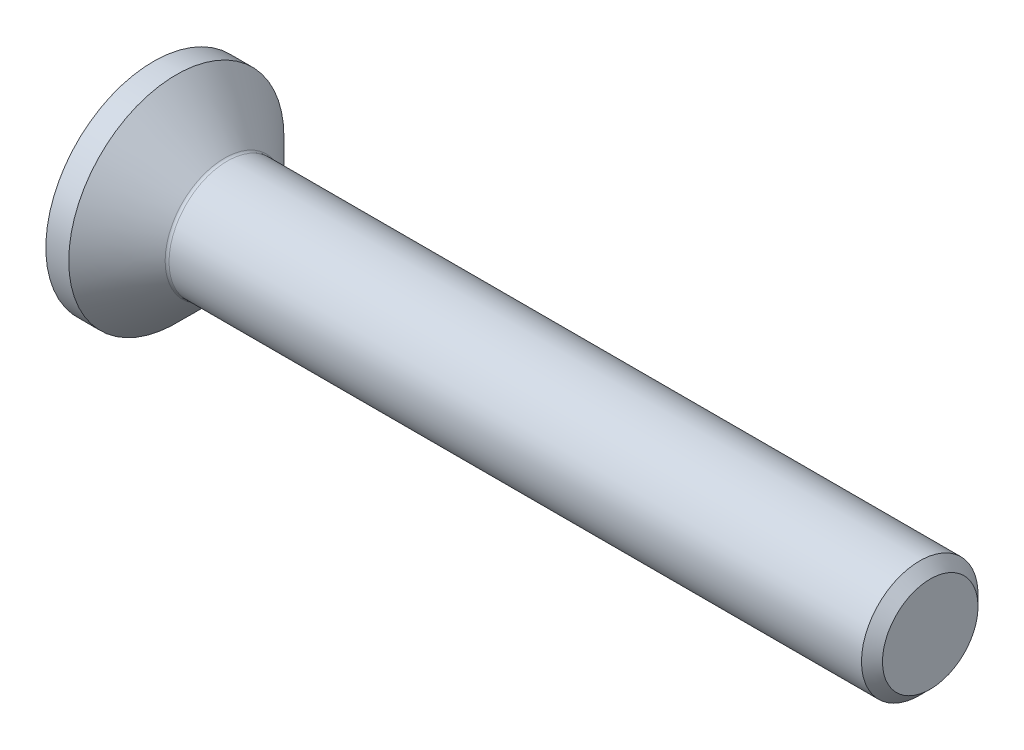
ISO-10303-21;
HEADER;
FILE_DESCRIPTION(('STEP AP214'),'2;1');
FILE_NAME('part.step','',(''),(''),'','','');
FILE_SCHEMA(('AUTOMOTIVE_DESIGN { 1 0 10303 214 1 1 1 1 }'));
ENDSEC;
DATA;
#1=APPLICATION_CONTEXT('core data for automotive mechanical design processes');
#2=APPLICATION_PROTOCOL_DEFINITION('international standard','automotive_design',2000,#1);
#3=PRODUCT_CONTEXT('',#1,'mechanical');
#4=PRODUCT('Part','Part','',(#3));
#5=PRODUCT_RELATED_PRODUCT_CATEGORY('part','',(#4));
#6=PRODUCT_DEFINITION_FORMATION('','',#4);
#7=PRODUCT_DEFINITION_CONTEXT('part definition',#1,'design');
#8=PRODUCT_DEFINITION('design','',#6,#7);
#9=PRODUCT_DEFINITION_SHAPE('','',#8);
#10=(LENGTH_UNIT() NAMED_UNIT(*) SI_UNIT(.MILLI.,.METRE.));
#11=(NAMED_UNIT(*) PLANE_ANGLE_UNIT() SI_UNIT($,.RADIAN.));
#12=(NAMED_UNIT(*) SI_UNIT($,.STERADIAN.) SOLID_ANGLE_UNIT());
#13=UNCERTAINTY_MEASURE_WITH_UNIT(LENGTH_MEASURE(1.E-05),#10,'distance_accuracy_value','');
#14=(GEOMETRIC_REPRESENTATION_CONTEXT(3) GLOBAL_UNCERTAINTY_ASSIGNED_CONTEXT((#13)) GLOBAL_UNIT_ASSIGNED_CONTEXT((#10,
#11,#12)) REPRESENTATION_CONTEXT('',''));
#15=CARTESIAN_POINT('',(0.,0.,0.));
#16=DIRECTION('',(0.,0.,1.));
#17=DIRECTION('',(1.,0.,0.));
#18=AXIS2_PLACEMENT_3D('',#15,#16,#17);
#19=CARTESIAN_POINT('',(1.86,0.,0.));
#20=DIRECTION('',(-1.,0.,0.));
#21=DIRECTION('',(0.,0.,1.));
#22=AXIS2_PLACEMENT_3D('',#19,#20,#21);
#23=CONICAL_SURFACE('',#22,1.5,0.785398163397448);
#24=CARTESIAN_POINT('',(0.589999999999997,0.,0.));
#25=DIRECTION('',(-1.,0.,0.));
#26=DIRECTION('',(0.,0.,1.));
#27=AXIS2_PLACEMENT_3D('',#24,#25,#26);
#28=CIRCLE('',#27,2.77);
#29=CARTESIAN_POINT('',(0.589999999999997,0.,2.77));
#30=VERTEX_POINT('',#29);
#31=EDGE_CURVE('E44',#30,#30,#28,.F.);
#32=ORIENTED_EDGE('',*,*,#31,.T.);
#33=EDGE_LOOP('',(#32));
#34=FACE_BOUND('',#33,.T.);
#35=CARTESIAN_POINT('',(1.83071067811865,0.,0.));
#36=DIRECTION('',(-1.,0.,0.));
#37=DIRECTION('',(0.,0.,1.));
#38=AXIS2_PLACEMENT_3D('',#35,#36,#37);
#39=CIRCLE('',#38,1.52928932188134);
#40=CARTESIAN_POINT('',(1.83071067811865,0.,1.52928932188134));
#41=VERTEX_POINT('',#40);
#42=EDGE_CURVE('E163',#41,#41,#39,.T.);
#43=ORIENTED_EDGE('',*,*,#42,.T.);
#44=EDGE_LOOP('',(#43));
#45=FACE_BOUND('',#44,.T.);
#46=ADVANCED_FACE('F40',(#34,#45),#23,.T.);
#47=CARTESIAN_POINT('',(-0.587069180985524,0.,0.));
#48=DIRECTION('',(-1.,0.,0.));
#49=DIRECTION('',(0.,0.,1.));
#50=AXIS2_PLACEMENT_3D('',#47,#48,#49);
#51=CYLINDRICAL_SURFACE('',#50,1.5);
#52=CARTESIAN_POINT('',(19.7295,0.,0.));
#53=DIRECTION('',(-1.,0.,0.));
#54=DIRECTION('',(0.,0.,1.));
#55=AXIS2_PLACEMENT_3D('',#52,#53,#54);
#56=CIRCLE('',#55,1.5);
#57=CARTESIAN_POINT('',(19.7295,0.,1.5));
#58=VERTEX_POINT('',#57);
#59=EDGE_CURVE('E49',#58,#58,#56,.T.);
#60=ORIENTED_EDGE('',*,*,#59,.T.);
#61=EDGE_LOOP('',(#60));
#62=FACE_BOUND('',#61,.T.);
#63=CARTESIAN_POINT('',(1.90142135623731,0.,0.));
#64=DIRECTION('',(-1.,0.,0.));
#65=DIRECTION('',(0.,0.,1.));
#66=AXIS2_PLACEMENT_3D('',#63,#64,#65);
#67=CIRCLE('',#66,1.5);
#68=CARTESIAN_POINT('',(1.90142135623731,0.,1.5));
#69=VERTEX_POINT('',#68);
#70=EDGE_CURVE('E160',#69,#69,#67,.F.);
#71=ORIENTED_EDGE('',*,*,#70,.T.);
#72=EDGE_LOOP('',(#71));
#73=FACE_BOUND('',#72,.T.);
#74=ADVANCED_FACE('F131',(#62,#73),#51,.T.);
#75=CARTESIAN_POINT('',(20.,1.5,0.));
#76=DIRECTION('',(-1.,0.,0.));
#77=DIRECTION('',(0.,0.,1.));
#78=AXIS2_PLACEMENT_3D('',#75,#76,#77);
#79=PLANE('',#78);
#80=CARTESIAN_POINT('',(20.,0.,0.));
#81=DIRECTION('',(-1.,0.,0.));
#82=DIRECTION('',(0.,0.,1.));
#83=AXIS2_PLACEMENT_3D('',#80,#81,#82);
#84=CIRCLE('',#83,1.2295);
#85=CARTESIAN_POINT('',(20.,0.,1.2295));
#86=VERTEX_POINT('',#85);
#87=EDGE_CURVE('E11',#86,#86,#84,.F.);
#88=ORIENTED_EDGE('',*,*,#87,.T.);
#89=EDGE_LOOP('',(#88));
#90=FACE_BOUND('',#89,.T.);
#91=ADVANCED_FACE('F137',(#90),#79,.F.);
#92=CARTESIAN_POINT('',(1.90142135623731,0.,0.));
#93=DIRECTION('',(-1.,0.,0.));
#94=DIRECTION('',(0.,0.,1.));
#95=AXIS2_PLACEMENT_3D('',#92,#93,#94);
#96=TOROIDAL_SURFACE('',#95,1.6,0.1);
#97=ORIENTED_EDGE('',*,*,#70,.F.);
#98=EDGE_LOOP('',(#97));
#99=FACE_BOUND('',#98,.T.);
#100=ORIENTED_EDGE('',*,*,#42,.F.);
#101=EDGE_LOOP('',(#100));
#102=FACE_BOUND('',#101,.T.);
#103=ADVANCED_FACE('F148',(#99,#102),#96,.F.);
#104=CARTESIAN_POINT('',(19.7295,0.,0.));
#105=DIRECTION('',(-1.,0.,0.));
#106=DIRECTION('',(0.,0.,1.));
#107=AXIS2_PLACEMENT_3D('',#104,#105,#106);
#108=CONICAL_SURFACE('',#107,1.5,0.78539816339744);
#109=ORIENTED_EDGE('',*,*,#87,.F.);
#110=EDGE_LOOP('',(#109));
#111=FACE_BOUND('',#110,.T.);
#112=ORIENTED_EDGE('',*,*,#59,.F.);
#113=EDGE_LOOP('',(#112));
#114=FACE_BOUND('',#113,.T.);
#115=ADVANCED_FACE('F42',(#111,#114),#108,.T.);
#116=CARTESIAN_POINT('',(11.8531386861314,0.,0.));
#117=DIRECTION('',(1.,0.,0.));
#118=DIRECTION('',(0.,0.,-1.));
#119=AXIS2_PLACEMENT_3D('',#116,#117,#118);
#120=CYLINDRICAL_SURFACE('',#119,2.77);
#121=ORIENTED_EDGE('',*,*,#31,.F.);
#122=EDGE_LOOP('',(#121));
#123=FACE_BOUND('',#122,.T.);
#124=CARTESIAN_POINT('',(0.,0.,0.));
#125=DIRECTION('',(1.,0.,0.));
#126=DIRECTION('',(0.,0.,-1.));
#127=AXIS2_PLACEMENT_3D('',#124,#125,#126);
#128=CIRCLE('',#127,2.77);
#129=CARTESIAN_POINT('',(0.,0.,-2.77));
#130=VERTEX_POINT('',#129);
#131=EDGE_CURVE('E229',#130,#130,#128,.F.);
#132=ORIENTED_EDGE('',*,*,#131,.F.);
#133=EDGE_LOOP('',(#132));
#134=FACE_BOUND('',#133,.T.);
#135=ADVANCED_FACE('F118',(#123,#134),#120,.T.);
#136=CARTESIAN_POINT('',(1.67735026918963,0.,0.));
#137=DIRECTION('',(-1.,0.,0.));
#138=DIRECTION('',(0.,0.,1.));
#139=AXIS2_PLACEMENT_3D('',#136,#137,#138);
#140=CONICAL_SURFACE('',#139,0.,1.0471975511966);
#141=CARTESIAN_POINT('',(1.1,0.,0.));
#142=DIRECTION('',(-1.,0.,0.));
#143=DIRECTION('',(0.,0.,1.));
#144=AXIS2_PLACEMENT_3D('',#141,#142,#143);
#145=CIRCLE('',#144,1.);
#146=CARTESIAN_POINT('',(1.1,0.5,0.866025403784439));
#147=VERTEX_POINT('',#146);
#148=CARTESIAN_POINT('',(1.1,1.,0.));
#149=VERTEX_POINT('',#148);
#150=EDGE_CURVE('E169',#147,#149,#145,.T.);
#151=ORIENTED_EDGE('',*,*,#150,.T.);
#152=CARTESIAN_POINT('',(1.1,0.5,-0.866025403784439));
#153=VERTEX_POINT('',#152);
#154=EDGE_CURVE('E164',#149,#153,#145,.T.);
#155=ORIENTED_EDGE('',*,*,#154,.T.);
#156=CARTESIAN_POINT('',(1.1,-0.5,-0.866025403784439));
#157=VERTEX_POINT('',#156);
#158=EDGE_CURVE('E167',#153,#157,#145,.T.);
#159=ORIENTED_EDGE('',*,*,#158,.T.);
#160=CARTESIAN_POINT('',(1.1,-1.,0.));
#161=VERTEX_POINT('',#160);
#162=EDGE_CURVE('E248',#157,#161,#145,.T.);
#163=ORIENTED_EDGE('',*,*,#162,.T.);
#164=CARTESIAN_POINT('',(1.1,-0.5,0.866025403784438));
#165=VERTEX_POINT('',#164);
#166=EDGE_CURVE('E56',#161,#165,#145,.T.);
#167=ORIENTED_EDGE('',*,*,#166,.T.);
#168=EDGE_CURVE('E178',#165,#147,#145,.T.);
#169=ORIENTED_EDGE('',*,*,#168,.T.);
#170=EDGE_LOOP('',(#151,#155,#159,#163,#167,#169));
#171=FACE_BOUND('',#170,.T.);
#172=CARTESIAN_POINT('',(1.67735026918963,0.,0.));
#173=VERTEX_POINT('',#172);
#174=VERTEX_LOOP('',#173);
#175=FACE_BOUND('',#174,.T.);
#176=ADVANCED_FACE('F115',(#171,#175),#140,.F.);
#177=CARTESIAN_POINT('',(1.1,0.,-1.15470053837925));
#178=DIRECTION('',(1.,0.,0.));
#179=DIRECTION('',(0.,0.,-1.));
#180=AXIS2_PLACEMENT_3D('',#177,#178,#179);
#181=PLANE('',#180);
#182=ORIENTED_EDGE('',*,*,#166,.F.);
#183=DIRECTION('',(0.,0.,-1.));
#184=VECTOR('',#183,1.);
#185=CARTESIAN_POINT('',(1.1,-1.,0.577350269189626));
#186=LINE('',#185,#184);
#187=CARTESIAN_POINT('',(1.1,-1.,0.577350269189626));
#188=VERTEX_POINT('',#187);
#189=EDGE_CURVE('E189',#188,#161,#186,.T.);
#190=ORIENTED_EDGE('',*,*,#189,.F.);
#191=DIRECTION('',(0.,-0.866025403784438,-0.5));
#192=VECTOR('',#191,1.);
#193=CARTESIAN_POINT('',(1.1,0.,1.15470053837925));
#194=LINE('',#193,#192);
#195=EDGE_CURVE('E213',#165,#188,#194,.T.);
#196=ORIENTED_EDGE('',*,*,#195,.F.);
#197=EDGE_LOOP('',(#182,#190,#196));
#198=FACE_BOUND('',#197,.T.);
#199=ADVANCED_FACE('F117',(#198),#181,.F.);
#200=ORIENTED_EDGE('',*,*,#168,.F.);
#201=CARTESIAN_POINT('',(1.1,0.,1.15470053837925));
#202=VERTEX_POINT('',#201);
#203=EDGE_CURVE('E210',#202,#165,#194,.T.);
#204=ORIENTED_EDGE('',*,*,#203,.F.);
#205=DIRECTION('',(0.,-0.866025403784439,0.5));
#206=VECTOR('',#205,1.);
#207=CARTESIAN_POINT('',(1.1,1.,0.577350269189626));
#208=LINE('',#207,#206);
#209=EDGE_CURVE('E217',#147,#202,#208,.T.);
#210=ORIENTED_EDGE('',*,*,#209,.F.);
#211=EDGE_LOOP('',(#200,#204,#210));
#212=FACE_BOUND('',#211,.T.);
#213=ADVANCED_FACE('F124',(#212),#181,.F.);
#214=ORIENTED_EDGE('',*,*,#150,.F.);
#215=CARTESIAN_POINT('',(1.1,1.,0.577350269189626));
#216=VERTEX_POINT('',#215);
#217=EDGE_CURVE('E214',#216,#147,#208,.T.);
#218=ORIENTED_EDGE('',*,*,#217,.F.);
#219=DIRECTION('',(0.,0.,1.));
#220=VECTOR('',#219,1.);
#221=CARTESIAN_POINT('',(1.1,1.,-0.577350269189625));
#222=LINE('',#221,#220);
#223=EDGE_CURVE('E221',#149,#216,#222,.T.);
#224=ORIENTED_EDGE('',*,*,#223,.F.);
#225=EDGE_LOOP('',(#214,#218,#224));
#226=FACE_BOUND('',#225,.T.);
#227=ADVANCED_FACE('F279',(#226),#181,.F.);
#228=ORIENTED_EDGE('',*,*,#154,.F.);
#229=CARTESIAN_POINT('',(1.1,1.,-0.577350269189625));
#230=VERTEX_POINT('',#229);
#231=EDGE_CURVE('E218',#230,#149,#222,.T.);
#232=ORIENTED_EDGE('',*,*,#231,.F.);
#233=DIRECTION('',(0.,0.866025403784438,0.5));
#234=VECTOR('',#233,1.);
#235=CARTESIAN_POINT('',(1.1,0.,-1.15470053837925));
#236=LINE('',#235,#234);
#237=EDGE_CURVE('E225',#153,#230,#236,.T.);
#238=ORIENTED_EDGE('',*,*,#237,.F.);
#239=EDGE_LOOP('',(#228,#232,#238));
#240=FACE_BOUND('',#239,.T.);
#241=ADVANCED_FACE('F284',(#240),#181,.F.);
#242=ORIENTED_EDGE('',*,*,#158,.F.);
#243=CARTESIAN_POINT('',(1.1,0.,-1.15470053837925));
#244=VERTEX_POINT('',#243);
#245=EDGE_CURVE('E222',#244,#153,#236,.T.);
#246=ORIENTED_EDGE('',*,*,#245,.F.);
#247=DIRECTION('',(0.,0.866025403784438,-0.5));
#248=VECTOR('',#247,1.);
#249=CARTESIAN_POINT('',(1.1,-0.999999999999999,-0.577350269189627));
#250=LINE('',#249,#248);
#251=EDGE_CURVE('E193',#157,#244,#250,.T.);
#252=ORIENTED_EDGE('',*,*,#251,.F.);
#253=EDGE_LOOP('',(#242,#246,#252));
#254=FACE_BOUND('',#253,.T.);
#255=ADVANCED_FACE('F253',(#254),#181,.F.);
#256=ORIENTED_EDGE('',*,*,#162,.F.);
#257=CARTESIAN_POINT('',(1.1,-0.999999999999999,-0.577350269189627));
#258=VERTEX_POINT('',#257);
#259=EDGE_CURVE('E226',#258,#157,#250,.T.);
#260=ORIENTED_EDGE('',*,*,#259,.F.);
#261=EDGE_CURVE('E209',#161,#258,#186,.T.);
#262=ORIENTED_EDGE('',*,*,#261,.F.);
#263=EDGE_LOOP('',(#256,#260,#262));
#264=FACE_BOUND('',#263,.T.);
#265=ADVANCED_FACE('F127',(#264),#181,.F.);
#266=CARTESIAN_POINT('',(1.1,-1.,0.577350269189626));
#267=DIRECTION('',(0.,1.,0.));
#268=DIRECTION('',(0.,0.,1.));
#269=AXIS2_PLACEMENT_3D('',#266,#267,#268);
#270=PLANE('',#269);
#271=DIRECTION('',(0.,0.,-1.));
#272=VECTOR('',#271,1.);
#273=CARTESIAN_POINT('',(0.,-1.,0.577350269189626));
#274=LINE('',#273,#272);
#275=CARTESIAN_POINT('',(0.,-1.,0.577350269189626));
#276=VERTEX_POINT('',#275);
#277=CARTESIAN_POINT('',(0.,-0.999999999999999,-0.577350269189627));
#278=VERTEX_POINT('',#277);
#279=EDGE_CURVE('E190',#276,#278,#274,.T.);
#280=ORIENTED_EDGE('',*,*,#279,.F.);
#281=DIRECTION('',(-1.,0.,0.));
#282=VECTOR('',#281,1.);
#283=CARTESIAN_POINT('',(1.1,-1.,0.577350269189626));
#284=LINE('',#283,#282);
#285=EDGE_CURVE('E185',#188,#276,#284,.T.);
#286=ORIENTED_EDGE('',*,*,#285,.F.);
#287=ORIENTED_EDGE('',*,*,#189,.T.);
#288=ORIENTED_EDGE('',*,*,#261,.T.);
#289=DIRECTION('',(-1.,0.,0.));
#290=VECTOR('',#289,1.);
#291=CARTESIAN_POINT('',(1.1,-0.999999999999999,-0.577350269189627));
#292=LINE('',#291,#290);
#293=EDGE_CURVE('E187',#258,#278,#292,.T.);
#294=ORIENTED_EDGE('',*,*,#293,.T.);
#295=EDGE_LOOP('',(#280,#286,#287,#288,#294));
#296=FACE_BOUND('',#295,.T.);
#297=ADVANCED_FACE('F242',(#296),#270,.T.);
#298=CARTESIAN_POINT('',(1.1,0.,1.15470053837925));
#299=DIRECTION('',(0.,0.5,-0.866025403784439));
#300=DIRECTION('',(0.,0.866025403784438,0.5));
#301=AXIS2_PLACEMENT_3D('',#298,#299,#300);
#302=PLANE('',#301);
#303=DIRECTION('',(0.,-0.866025403784438,-0.5));
#304=VECTOR('',#303,1.);
#305=CARTESIAN_POINT('',(0.,0.,1.15470053837925));
#306=LINE('',#305,#304);
#307=CARTESIAN_POINT('',(0.,0.,1.15470053837925));
#308=VERTEX_POINT('',#307);
#309=EDGE_CURVE('E194',#308,#276,#306,.T.);
#310=ORIENTED_EDGE('',*,*,#309,.F.);
#311=DIRECTION('',(-1.,0.,0.));
#312=VECTOR('',#311,1.);
#313=CARTESIAN_POINT('',(1.1,0.,1.15470053837925));
#314=LINE('',#313,#312);
#315=EDGE_CURVE('E183',#202,#308,#314,.T.);
#316=ORIENTED_EDGE('',*,*,#315,.F.);
#317=ORIENTED_EDGE('',*,*,#203,.T.);
#318=ORIENTED_EDGE('',*,*,#195,.T.);
#319=ORIENTED_EDGE('',*,*,#285,.T.);
#320=EDGE_LOOP('',(#310,#316,#317,#318,#319));
#321=FACE_BOUND('',#320,.T.);
#322=ADVANCED_FACE('F272',(#321),#302,.T.);
#323=CARTESIAN_POINT('',(1.1,1.,0.577350269189626));
#324=DIRECTION('',(0.,-0.5,-0.866025403784438));
#325=DIRECTION('',(0.,0.866025403784439,-0.5));
#326=AXIS2_PLACEMENT_3D('',#323,#324,#325);
#327=PLANE('',#326);
#328=DIRECTION('',(0.,-0.866025403784439,0.5));
#329=VECTOR('',#328,1.);
#330=CARTESIAN_POINT('',(0.,1.,0.577350269189626));
#331=LINE('',#330,#329);
#332=CARTESIAN_POINT('',(0.,1.,0.577350269189626));
#333=VERTEX_POINT('',#332);
#334=EDGE_CURVE('E197',#333,#308,#331,.T.);
#335=ORIENTED_EDGE('',*,*,#334,.F.);
#336=DIRECTION('',(-1.,0.,0.));
#337=VECTOR('',#336,1.);
#338=CARTESIAN_POINT('',(1.1,1.,0.577350269189626));
#339=LINE('',#338,#337);
#340=EDGE_CURVE('E181',#216,#333,#339,.T.);
#341=ORIENTED_EDGE('',*,*,#340,.F.);
#342=ORIENTED_EDGE('',*,*,#217,.T.);
#343=ORIENTED_EDGE('',*,*,#209,.T.);
#344=ORIENTED_EDGE('',*,*,#315,.T.);
#345=EDGE_LOOP('',(#335,#341,#342,#343,#344));
#346=FACE_BOUND('',#345,.T.);
#347=ADVANCED_FACE('F266',(#346),#327,.T.);
#348=CARTESIAN_POINT('',(1.1,1.,-0.577350269189625));
#349=DIRECTION('',(0.,-1.,0.));
#350=DIRECTION('',(0.,0.,-1.));
#351=AXIS2_PLACEMENT_3D('',#348,#349,#350);
#352=PLANE('',#351);
#353=DIRECTION('',(0.,0.,1.));
#354=VECTOR('',#353,1.);
#355=CARTESIAN_POINT('',(0.,1.,-0.577350269189625));
#356=LINE('',#355,#354);
#357=CARTESIAN_POINT('',(0.,1.,-0.577350269189625));
#358=VERTEX_POINT('',#357);
#359=EDGE_CURVE('E200',#358,#333,#356,.T.);
#360=ORIENTED_EDGE('',*,*,#359,.F.);
#361=DIRECTION('',(-1.,0.,0.));
#362=VECTOR('',#361,1.);
#363=CARTESIAN_POINT('',(1.1,1.,-0.577350269189625));
#364=LINE('',#363,#362);
#365=EDGE_CURVE('E179',#230,#358,#364,.T.);
#366=ORIENTED_EDGE('',*,*,#365,.F.);
#367=ORIENTED_EDGE('',*,*,#231,.T.);
#368=ORIENTED_EDGE('',*,*,#223,.T.);
#369=ORIENTED_EDGE('',*,*,#340,.T.);
#370=EDGE_LOOP('',(#360,#366,#367,#368,#369));
#371=FACE_BOUND('',#370,.T.);
#372=ADVANCED_FACE('F262',(#371),#352,.T.);
#373=CARTESIAN_POINT('',(1.1,0.,-1.15470053837925));
#374=DIRECTION('',(0.,-0.5,0.866025403784438));
#375=DIRECTION('',(0.,-0.866025403784439,-0.5));
#376=AXIS2_PLACEMENT_3D('',#373,#374,#375);
#377=PLANE('',#376);
#378=DIRECTION('',(0.,0.866025403784438,0.5));
#379=VECTOR('',#378,1.);
#380=CARTESIAN_POINT('',(0.,0.,-1.15470053837925));
#381=LINE('',#380,#379);
#382=CARTESIAN_POINT('',(0.,0.,-1.15470053837925));
#383=VERTEX_POINT('',#382);
#384=EDGE_CURVE('E203',#383,#358,#381,.T.);
#385=ORIENTED_EDGE('',*,*,#384,.F.);
#386=DIRECTION('',(-1.,0.,0.));
#387=VECTOR('',#386,1.);
#388=CARTESIAN_POINT('',(1.1,0.,-1.15470053837925));
#389=LINE('',#388,#387);
#390=EDGE_CURVE('E171',#244,#383,#389,.T.);
#391=ORIENTED_EDGE('',*,*,#390,.F.);
#392=ORIENTED_EDGE('',*,*,#245,.T.);
#393=ORIENTED_EDGE('',*,*,#237,.T.);
#394=ORIENTED_EDGE('',*,*,#365,.T.);
#395=EDGE_LOOP('',(#385,#391,#392,#393,#394));
#396=FACE_BOUND('',#395,.T.);
#397=ADVANCED_FACE('F257',(#396),#377,.T.);
#398=CARTESIAN_POINT('',(1.1,-0.999999999999999,-0.577350269189627));
#399=DIRECTION('',(0.,0.5,0.866025403784439));
#400=DIRECTION('',(0.,-0.866025403784438,0.5));
#401=AXIS2_PLACEMENT_3D('',#398,#399,#400);
#402=PLANE('',#401);
#403=DIRECTION('',(0.,0.866025403784438,-0.5));
#404=VECTOR('',#403,1.);
#405=CARTESIAN_POINT('',(0.,-0.999999999999999,-0.577350269189627));
#406=LINE('',#405,#404);
#407=EDGE_CURVE('E64',#278,#383,#406,.T.);
#408=ORIENTED_EDGE('',*,*,#407,.F.);
#409=ORIENTED_EDGE('',*,*,#293,.F.);
#410=ORIENTED_EDGE('',*,*,#259,.T.);
#411=ORIENTED_EDGE('',*,*,#251,.T.);
#412=ORIENTED_EDGE('',*,*,#390,.T.);
#413=EDGE_LOOP('',(#408,#409,#410,#411,#412));
#414=FACE_BOUND('',#413,.T.);
#415=ADVANCED_FACE('F146',(#414),#402,.T.);
#416=CARTESIAN_POINT('',(0.,0.,0.));
#417=DIRECTION('',(1.,0.,0.));
#418=DIRECTION('',(0.,0.,-1.));
#419=AXIS2_PLACEMENT_3D('',#416,#417,#418);
#420=PLANE('',#419);
#421=ORIENTED_EDGE('',*,*,#131,.T.);
#422=EDGE_LOOP('',(#421));
#423=FACE_BOUND('',#422,.T.);
#424=ORIENTED_EDGE('',*,*,#407,.T.);
#425=ORIENTED_EDGE('',*,*,#384,.T.);
#426=ORIENTED_EDGE('',*,*,#359,.T.);
#427=ORIENTED_EDGE('',*,*,#334,.T.);
#428=ORIENTED_EDGE('',*,*,#309,.T.);
#429=ORIENTED_EDGE('',*,*,#279,.T.);
#430=EDGE_LOOP('',(#424,#425,#426,#427,#428,#429));
#431=FACE_BOUND('',#430,.T.);
#432=ADVANCED_FACE('F144',(#423,#431),#420,.F.);
#433=CLOSED_SHELL('',(#46,#74,#91,#103,#115,#135,#176,#199,#213,#227,#241,#255,#265,#297,#322,
#347,#372,#397,#415,#432));
#434=MANIFOLD_SOLID_BREP('B2',#433);
#435=ADVANCED_BREP_SHAPE_REPRESENTATION('',(#18,#434),#14);
#436=SHAPE_DEFINITION_REPRESENTATION(#9,#435);
ENDSEC;
END-ISO-10303-21;
